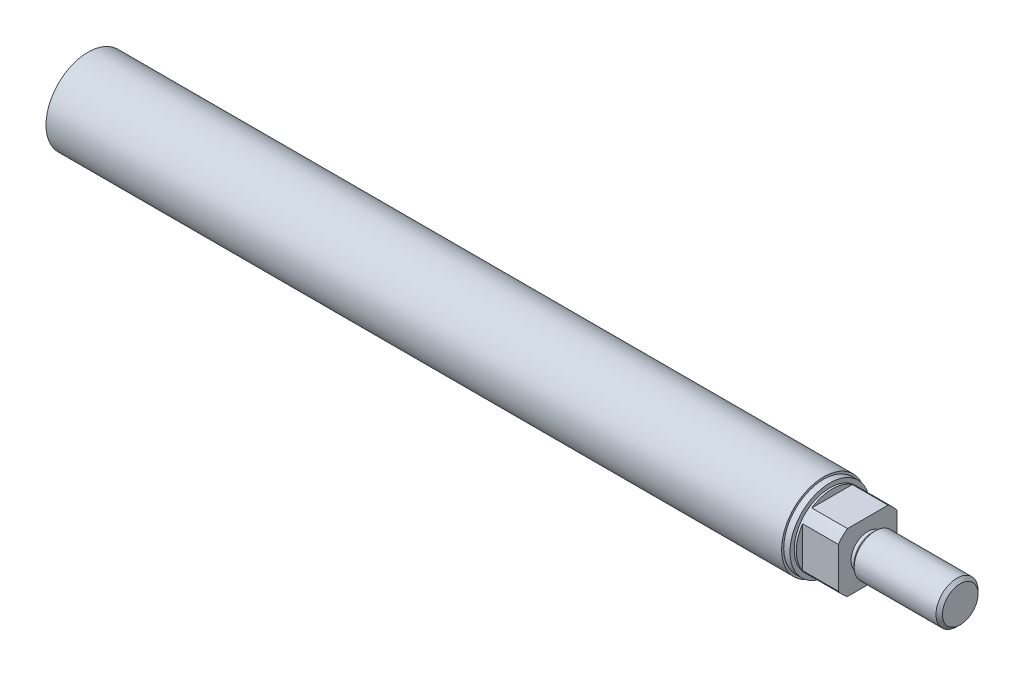
ISO-10303-21;
HEADER;
FILE_DESCRIPTION(('STEP AP214'),'2;1');
FILE_NAME('part.step','',(''),(''),'','','');
FILE_SCHEMA(('AUTOMOTIVE_DESIGN { 1 0 10303 214 1 1 1 1 }'));
ENDSEC;
DATA;
#1=APPLICATION_CONTEXT('core data for automotive mechanical design processes');
#2=APPLICATION_PROTOCOL_DEFINITION('international standard','automotive_design',2000,#1);
#3=PRODUCT_CONTEXT('',#1,'mechanical');
#4=PRODUCT('Part','Part','',(#3));
#5=PRODUCT_RELATED_PRODUCT_CATEGORY('part','',(#4));
#6=PRODUCT_DEFINITION_FORMATION('','',#4);
#7=PRODUCT_DEFINITION_CONTEXT('part definition',#1,'design');
#8=PRODUCT_DEFINITION('design','',#6,#7);
#9=PRODUCT_DEFINITION_SHAPE('','',#8);
#10=(LENGTH_UNIT() NAMED_UNIT(*) SI_UNIT(.MILLI.,.METRE.));
#11=(NAMED_UNIT(*) PLANE_ANGLE_UNIT() SI_UNIT($,.RADIAN.));
#12=(NAMED_UNIT(*) SI_UNIT($,.STERADIAN.) SOLID_ANGLE_UNIT());
#13=UNCERTAINTY_MEASURE_WITH_UNIT(LENGTH_MEASURE(1.E-05),#10,'distance_accuracy_value','');
#14=(GEOMETRIC_REPRESENTATION_CONTEXT(3) GLOBAL_UNCERTAINTY_ASSIGNED_CONTEXT((#13)) GLOBAL_UNIT_ASSIGNED_CONTEXT((#10,
#11,#12)) REPRESENTATION_CONTEXT('',''));
#15=CARTESIAN_POINT('',(0.,0.,0.));
#16=DIRECTION('',(0.,0.,1.));
#17=DIRECTION('',(1.,0.,0.));
#18=AXIS2_PLACEMENT_3D('',#15,#16,#17);
#19=CARTESIAN_POINT('',(42.5,0.,0.));
#20=DIRECTION('',(-1.,0.,0.));
#21=DIRECTION('',(0.,0.,1.));
#22=AXIS2_PLACEMENT_3D('',#19,#20,#21);
#23=CYLINDRICAL_SURFACE('',#22,8.5);
#24=CARTESIAN_POINT('',(11.5,0.,0.));
#25=DIRECTION('',(-1.,0.,0.));
#26=DIRECTION('',(0.,0.,1.));
#27=AXIS2_PLACEMENT_3D('',#24,#25,#26);
#28=CIRCLE('',#27,8.5);
#29=CARTESIAN_POINT('',(11.5,0.,8.5));
#30=VERTEX_POINT('',#29);
#31=EDGE_CURVE('E122',#30,#30,#28,.T.);
#32=ORIENTED_EDGE('',*,*,#31,.F.);
#33=EDGE_LOOP('',(#32));
#34=FACE_BOUND('',#33,.T.);
#35=DIRECTION('',(-1.,0.,0.));
#36=VECTOR('',#35,1.);
#37=CARTESIAN_POINT('',(42.5,7.,-4.82182538049648));
#38=LINE('',#37,#36);
#39=CARTESIAN_POINT('',(20.5,7.,-4.82182538049648));
#40=VERTEX_POINT('',#39);
#41=CARTESIAN_POINT('',(12.,7.,-4.82182538049648));
#42=VERTEX_POINT('',#41);
#43=EDGE_CURVE('E154',#40,#42,#38,.T.);
#44=ORIENTED_EDGE('',*,*,#43,.F.);
#45=CARTESIAN_POINT('',(20.5,0.,0.));
#46=DIRECTION('',(-1.,0.,0.));
#47=DIRECTION('',(0.,0.,1.));
#48=AXIS2_PLACEMENT_3D('',#45,#46,#47);
#49=CIRCLE('',#48,8.5);
#50=CARTESIAN_POINT('',(20.5,4.82182538049648,-7.));
#51=VERTEX_POINT('',#50);
#52=EDGE_CURVE('E123',#40,#51,#49,.T.);
#53=ORIENTED_EDGE('',*,*,#52,.T.);
#54=DIRECTION('',(-1.,0.,0.));
#55=VECTOR('',#54,1.);
#56=CARTESIAN_POINT('',(42.5,4.82182538049648,-7.));
#57=LINE('',#56,#55);
#58=CARTESIAN_POINT('',(12.,4.82182538049648,-7.));
#59=VERTEX_POINT('',#58);
#60=EDGE_CURVE('E160',#59,#51,#57,.F.);
#61=ORIENTED_EDGE('',*,*,#60,.F.);
#62=CARTESIAN_POINT('',(12.,0.,0.));
#63=DIRECTION('',(1.,0.,0.));
#64=DIRECTION('',(0.,0.,-1.));
#65=AXIS2_PLACEMENT_3D('',#62,#63,#64);
#66=CIRCLE('',#65,8.5);
#67=CARTESIAN_POINT('',(12.,-4.82182538049648,-7.));
#68=VERTEX_POINT('',#67);
#69=EDGE_CURVE('E44',#68,#59,#66,.T.);
#70=ORIENTED_EDGE('',*,*,#69,.F.);
#71=DIRECTION('',(-1.,0.,0.));
#72=VECTOR('',#71,1.);
#73=CARTESIAN_POINT('',(42.5,-4.82182538049648,-7.));
#74=LINE('',#73,#72);
#75=CARTESIAN_POINT('',(20.5,-4.82182538049648,-7.));
#76=VERTEX_POINT('',#75);
#77=EDGE_CURVE('E158',#76,#68,#74,.T.);
#78=ORIENTED_EDGE('',*,*,#77,.F.);
#79=CARTESIAN_POINT('',(20.5,-7.,-4.82182538049648));
#80=VERTEX_POINT('',#79);
#81=EDGE_CURVE('E130',#76,#80,#49,.T.);
#82=ORIENTED_EDGE('',*,*,#81,.T.);
#83=DIRECTION('',(-1.,0.,0.));
#84=VECTOR('',#83,1.);
#85=CARTESIAN_POINT('',(42.5,-7.,-4.82182538049648));
#86=LINE('',#85,#84);
#87=CARTESIAN_POINT('',(12.,-7.,-4.82182538049648));
#88=VERTEX_POINT('',#87);
#89=EDGE_CURVE('E59',#88,#80,#86,.F.);
#90=ORIENTED_EDGE('',*,*,#89,.F.);
#91=CARTESIAN_POINT('',(12.,-7.,4.82182538049648));
#92=VERTEX_POINT('',#91);
#93=EDGE_CURVE('E241',#92,#88,#66,.T.);
#94=ORIENTED_EDGE('',*,*,#93,.F.);
#95=DIRECTION('',(-1.,0.,0.));
#96=VECTOR('',#95,1.);
#97=CARTESIAN_POINT('',(42.5,-7.,4.82182538049648));
#98=LINE('',#97,#96);
#99=CARTESIAN_POINT('',(20.5,-7.,4.82182538049648));
#100=VERTEX_POINT('',#99);
#101=EDGE_CURVE('E162',#100,#92,#98,.T.);
#102=ORIENTED_EDGE('',*,*,#101,.F.);
#103=CARTESIAN_POINT('',(20.5,-4.82182538049648,7.));
#104=VERTEX_POINT('',#103);
#105=EDGE_CURVE('E125',#100,#104,#49,.T.);
#106=ORIENTED_EDGE('',*,*,#105,.T.);
#107=DIRECTION('',(-1.,0.,0.));
#108=VECTOR('',#107,1.);
#109=CARTESIAN_POINT('',(42.5,-4.82182538049648,7.));
#110=LINE('',#109,#108);
#111=CARTESIAN_POINT('',(12.,-4.82182538049648,7.));
#112=VERTEX_POINT('',#111);
#113=EDGE_CURVE('E51',#112,#104,#110,.F.);
#114=ORIENTED_EDGE('',*,*,#113,.F.);
#115=CARTESIAN_POINT('',(12.,4.82182538049648,7.));
#116=VERTEX_POINT('',#115);
#117=EDGE_CURVE('E39',#116,#112,#66,.T.);
#118=ORIENTED_EDGE('',*,*,#117,.F.);
#119=DIRECTION('',(-1.,0.,0.));
#120=VECTOR('',#119,1.);
#121=CARTESIAN_POINT('',(42.5,4.82182538049648,7.));
#122=LINE('',#121,#120);
#123=CARTESIAN_POINT('',(20.5,4.82182538049648,7.));
#124=VERTEX_POINT('',#123);
#125=EDGE_CURVE('E102',#124,#116,#122,.T.);
#126=ORIENTED_EDGE('',*,*,#125,.F.);
#127=CARTESIAN_POINT('',(20.5,7.,4.82182538049648));
#128=VERTEX_POINT('',#127);
#129=EDGE_CURVE('E116',#124,#128,#49,.T.);
#130=ORIENTED_EDGE('',*,*,#129,.T.);
#131=DIRECTION('',(-1.,0.,0.));
#132=VECTOR('',#131,1.);
#133=CARTESIAN_POINT('',(42.5,7.,4.82182538049648));
#134=LINE('',#133,#132);
#135=CARTESIAN_POINT('',(12.,7.,4.82182538049648));
#136=VERTEX_POINT('',#135);
#137=EDGE_CURVE('E156',#136,#128,#134,.F.);
#138=ORIENTED_EDGE('',*,*,#137,.F.);
#139=EDGE_CURVE('E11',#42,#136,#66,.T.);
#140=ORIENTED_EDGE('',*,*,#139,.F.);
#141=EDGE_LOOP('',(#44,#53,#61,#70,#78,#82,#90,#94,#102,#106,#114,#118,#126,#130,#138,#140));
#142=FACE_BOUND('',#141,.T.);
#143=ADVANCED_FACE('F35',(#34,#142),#23,.T.);
#144=CARTESIAN_POINT('',(20.5,8.5,0.));
#145=DIRECTION('',(-1.,0.,0.));
#146=DIRECTION('',(0.,0.,1.));
#147=AXIS2_PLACEMENT_3D('',#144,#145,#146);
#148=PLANE('',#147);
#149=CARTESIAN_POINT('',(20.5,0.,0.));
#150=DIRECTION('',(-1.,0.,0.));
#151=DIRECTION('',(0.,0.,1.));
#152=AXIS2_PLACEMENT_3D('',#149,#150,#151);
#153=CIRCLE('',#152,4.);
#154=CARTESIAN_POINT('',(20.5,0.,4.));
#155=VERTEX_POINT('',#154);
#156=EDGE_CURVE('E132',#155,#155,#153,.T.);
#157=ORIENTED_EDGE('',*,*,#156,.T.);
#158=EDGE_LOOP('',(#157));
#159=FACE_BOUND('',#158,.T.);
#160=DIRECTION('',(0.,0.,-1.));
#161=VECTOR('',#160,1.);
#162=CARTESIAN_POINT('',(20.5,7.,0.));
#163=LINE('',#162,#161);
#164=EDGE_CURVE('E121',#128,#40,#163,.T.);
#165=ORIENTED_EDGE('',*,*,#164,.F.);
#166=ORIENTED_EDGE('',*,*,#129,.F.);
#167=DIRECTION('',(0.,1.,0.));
#168=VECTOR('',#167,1.);
#169=CARTESIAN_POINT('',(20.5,8.5,7.));
#170=LINE('',#169,#168);
#171=EDGE_CURVE('E99',#104,#124,#170,.T.);
#172=ORIENTED_EDGE('',*,*,#171,.F.);
#173=ORIENTED_EDGE('',*,*,#105,.F.);
#174=DIRECTION('',(0.,0.,1.));
#175=VECTOR('',#174,1.);
#176=CARTESIAN_POINT('',(20.5,-7.,0.));
#177=LINE('',#176,#175);
#178=EDGE_CURVE('E108',#80,#100,#177,.T.);
#179=ORIENTED_EDGE('',*,*,#178,.F.);
#180=ORIENTED_EDGE('',*,*,#81,.F.);
#181=DIRECTION('',(0.,-1.,0.));
#182=VECTOR('',#181,1.);
#183=CARTESIAN_POINT('',(20.5,8.5,-7.));
#184=LINE('',#183,#182);
#185=EDGE_CURVE('E240',#51,#76,#184,.T.);
#186=ORIENTED_EDGE('',*,*,#185,.F.);
#187=ORIENTED_EDGE('',*,*,#52,.F.);
#188=EDGE_LOOP('',(#165,#166,#172,#173,#179,#180,#186,#187));
#189=FACE_BOUND('',#188,.T.);
#190=ADVANCED_FACE('F119',(#159,#189),#148,.F.);
#191=CARTESIAN_POINT('',(-165.,0.,0.));
#192=DIRECTION('',(1.,0.,0.));
#193=DIRECTION('',(0.,0.,-1.));
#194=AXIS2_PLACEMENT_3D('',#191,#192,#193);
#195=PLANE('',#194);
#196=CARTESIAN_POINT('',(-165.,0.,0.));
#197=DIRECTION('',(-1.,0.,0.));
#198=DIRECTION('',(0.,0.,1.));
#199=AXIS2_PLACEMENT_3D('',#196,#197,#198);
#200=CIRCLE('',#199,10.);
#201=CARTESIAN_POINT('',(-165.,0.,10.));
#202=VERTEX_POINT('',#201);
#203=EDGE_CURVE('E109',#202,#202,#200,.T.);
#204=ORIENTED_EDGE('',*,*,#203,.T.);
#205=EDGE_LOOP('',(#204));
#206=FACE_BOUND('',#205,.T.);
#207=ADVANCED_FACE('F37',(#206),#195,.F.);
#208=CARTESIAN_POINT('',(42.5,0.,0.));
#209=DIRECTION('',(-1.,0.,0.));
#210=DIRECTION('',(0.,0.,1.));
#211=AXIS2_PLACEMENT_3D('',#208,#209,#210);
#212=CYLINDRICAL_SURFACE('',#211,10.);
#213=ORIENTED_EDGE('',*,*,#203,.F.);
#214=EDGE_LOOP('',(#213));
#215=FACE_BOUND('',#214,.T.);
#216=CARTESIAN_POINT('',(10.,0.,0.));
#217=DIRECTION('',(-1.,0.,0.));
#218=DIRECTION('',(0.,0.,1.));
#219=AXIS2_PLACEMENT_3D('',#216,#217,#218);
#220=CIRCLE('',#219,10.);
#221=CARTESIAN_POINT('',(10.,0.,10.));
#222=VERTEX_POINT('',#221);
#223=EDGE_CURVE('E231',#222,#222,#220,.T.);
#224=ORIENTED_EDGE('',*,*,#223,.T.);
#225=EDGE_LOOP('',(#224));
#226=FACE_BOUND('',#225,.T.);
#227=ADVANCED_FACE('F218',(#215,#226),#212,.T.);
#228=CARTESIAN_POINT('',(10.,10.,0.));
#229=DIRECTION('',(-1.,0.,0.));
#230=DIRECTION('',(0.,0.,1.));
#231=AXIS2_PLACEMENT_3D('',#228,#229,#230);
#232=PLANE('',#231);
#233=ORIENTED_EDGE('',*,*,#223,.F.);
#234=EDGE_LOOP('',(#233));
#235=FACE_BOUND('',#234,.T.);
#236=CARTESIAN_POINT('',(10.,0.,0.));
#237=DIRECTION('',(-1.,0.,0.));
#238=DIRECTION('',(0.,0.,1.));
#239=AXIS2_PLACEMENT_3D('',#236,#237,#238);
#240=CIRCLE('',#239,9.5);
#241=CARTESIAN_POINT('',(10.,0.,9.5));
#242=VERTEX_POINT('',#241);
#243=EDGE_CURVE('E232',#242,#242,#240,.T.);
#244=ORIENTED_EDGE('',*,*,#243,.T.);
#245=EDGE_LOOP('',(#244));
#246=FACE_BOUND('',#245,.T.);
#247=ADVANCED_FACE('F215',(#235,#246),#232,.F.);
#248=CARTESIAN_POINT('',(42.5,0.,0.));
#249=DIRECTION('',(-1.,0.,0.));
#250=DIRECTION('',(0.,0.,1.));
#251=AXIS2_PLACEMENT_3D('',#248,#249,#250);
#252=CYLINDRICAL_SURFACE('',#251,9.5);
#253=ORIENTED_EDGE('',*,*,#243,.F.);
#254=EDGE_LOOP('',(#253));
#255=FACE_BOUND('',#254,.T.);
#256=CARTESIAN_POINT('',(11.5,0.,0.));
#257=DIRECTION('',(-1.,0.,0.));
#258=DIRECTION('',(0.,0.,1.));
#259=AXIS2_PLACEMENT_3D('',#256,#257,#258);
#260=CIRCLE('',#259,9.5);
#261=CARTESIAN_POINT('',(11.5,0.,9.5));
#262=VERTEX_POINT('',#261);
#263=EDGE_CURVE('E127',#262,#262,#260,.T.);
#264=ORIENTED_EDGE('',*,*,#263,.T.);
#265=EDGE_LOOP('',(#264));
#266=FACE_BOUND('',#265,.T.);
#267=ADVANCED_FACE('F211',(#255,#266),#252,.T.);
#268=CARTESIAN_POINT('',(11.5,9.5,0.));
#269=DIRECTION('',(-1.,0.,0.));
#270=DIRECTION('',(0.,0.,1.));
#271=AXIS2_PLACEMENT_3D('',#268,#269,#270);
#272=PLANE('',#271);
#273=ORIENTED_EDGE('',*,*,#263,.F.);
#274=EDGE_LOOP('',(#273));
#275=FACE_BOUND('',#274,.T.);
#276=ORIENTED_EDGE('',*,*,#31,.T.);
#277=EDGE_LOOP('',(#276));
#278=FACE_BOUND('',#277,.T.);
#279=ADVANCED_FACE('F207',(#275,#278),#272,.F.);
#280=CARTESIAN_POINT('',(42.5,0.,0.));
#281=DIRECTION('',(-1.,0.,0.));
#282=DIRECTION('',(0.,0.,1.));
#283=AXIS2_PLACEMENT_3D('',#280,#281,#282);
#284=CYLINDRICAL_SURFACE('',#283,4.);
#285=ORIENTED_EDGE('',*,*,#156,.F.);
#286=EDGE_LOOP('',(#285));
#287=FACE_BOUND('',#286,.T.);
#288=CARTESIAN_POINT('',(21.5,0.,0.));
#289=DIRECTION('',(-1.,0.,0.));
#290=DIRECTION('',(0.,0.,1.));
#291=AXIS2_PLACEMENT_3D('',#288,#289,#290);
#292=CIRCLE('',#291,4.);
#293=CARTESIAN_POINT('',(21.5,0.,4.));
#294=VERTEX_POINT('',#293);
#295=EDGE_CURVE('E136',#294,#294,#292,.T.);
#296=ORIENTED_EDGE('',*,*,#295,.T.);
#297=EDGE_LOOP('',(#296));
#298=FACE_BOUND('',#297,.T.);
#299=ADVANCED_FACE('F210',(#287,#298),#284,.T.);
#300=CARTESIAN_POINT('',(21.5,4.,0.));
#301=DIRECTION('',(1.,0.,0.));
#302=DIRECTION('',(0.,0.,-1.));
#303=AXIS2_PLACEMENT_3D('',#300,#301,#302);
#304=PLANE('',#303);
#305=ORIENTED_EDGE('',*,*,#295,.F.);
#306=EDGE_LOOP('',(#305));
#307=FACE_BOUND('',#306,.T.);
#308=CARTESIAN_POINT('',(21.5,0.,0.));
#309=DIRECTION('',(-1.,0.,0.));
#310=DIRECTION('',(0.,0.,1.));
#311=AXIS2_PLACEMENT_3D('',#308,#309,#310);
#312=CIRCLE('',#311,4.2330000000001);
#313=CARTESIAN_POINT('',(21.5,0.,4.2330000000001));
#314=VERTEX_POINT('',#313);
#315=EDGE_CURVE('E140',#314,#314,#312,.T.);
#316=ORIENTED_EDGE('',*,*,#315,.T.);
#317=EDGE_LOOP('',(#316));
#318=FACE_BOUND('',#317,.T.);
#319=ADVANCED_FACE('F280',(#307,#318),#304,.F.);
#320=CARTESIAN_POINT('',(22.267,0.,0.));
#321=DIRECTION('',(1.,0.,0.));
#322=DIRECTION('',(0.,0.,-1.));
#323=AXIS2_PLACEMENT_3D('',#320,#321,#322);
#324=CONICAL_SURFACE('',#323,5.,0.785398163397383);
#325=ORIENTED_EDGE('',*,*,#315,.F.);
#326=EDGE_LOOP('',(#325));
#327=FACE_BOUND('',#326,.T.);
#328=CARTESIAN_POINT('',(22.267,0.,0.));
#329=DIRECTION('',(-1.,0.,0.));
#330=DIRECTION('',(0.,0.,1.));
#331=AXIS2_PLACEMENT_3D('',#328,#329,#330);
#332=CIRCLE('',#331,5.);
#333=CARTESIAN_POINT('',(22.267,0.,5.));
#334=VERTEX_POINT('',#333);
#335=EDGE_CURVE('E145',#334,#334,#332,.T.);
#336=ORIENTED_EDGE('',*,*,#335,.T.);
#337=EDGE_LOOP('',(#336));
#338=FACE_BOUND('',#337,.T.);
#339=ADVANCED_FACE('F276',(#327,#338),#324,.T.);
#340=CARTESIAN_POINT('',(42.5,0.,0.));
#341=DIRECTION('',(-1.,0.,0.));
#342=DIRECTION('',(0.,0.,1.));
#343=AXIS2_PLACEMENT_3D('',#340,#341,#342);
#344=CYLINDRICAL_SURFACE('',#343,5.);
#345=ORIENTED_EDGE('',*,*,#335,.F.);
#346=EDGE_LOOP('',(#345));
#347=FACE_BOUND('',#346,.T.);
#348=CARTESIAN_POINT('',(41.733,0.,0.));
#349=DIRECTION('',(-1.,0.,0.));
#350=DIRECTION('',(0.,0.,1.));
#351=AXIS2_PLACEMENT_3D('',#348,#349,#350);
#352=CIRCLE('',#351,5.);
#353=CARTESIAN_POINT('',(41.733,0.,5.));
#354=VERTEX_POINT('',#353);
#355=EDGE_CURVE('E148',#354,#354,#352,.T.);
#356=ORIENTED_EDGE('',*,*,#355,.T.);
#357=EDGE_LOOP('',(#356));
#358=FACE_BOUND('',#357,.T.);
#359=ADVANCED_FACE('F269',(#347,#358),#344,.T.);
#360=CARTESIAN_POINT('',(42.5,0.,0.));
#361=DIRECTION('',(-1.,0.,0.));
#362=DIRECTION('',(0.,0.,1.));
#363=AXIS2_PLACEMENT_3D('',#360,#361,#362);
#364=CONICAL_SURFACE('',#363,4.2330000000001,0.78539816339738);
#365=ORIENTED_EDGE('',*,*,#355,.F.);
#366=EDGE_LOOP('',(#365));
#367=FACE_BOUND('',#366,.T.);
#368=CARTESIAN_POINT('',(42.5,0.,0.));
#369=DIRECTION('',(-1.,0.,0.));
#370=DIRECTION('',(0.,0.,1.));
#371=AXIS2_PLACEMENT_3D('',#368,#369,#370);
#372=CIRCLE('',#371,4.2330000000001);
#373=CARTESIAN_POINT('',(42.5,0.,4.2330000000001));
#374=VERTEX_POINT('',#373);
#375=EDGE_CURVE('E151',#374,#374,#372,.T.);
#376=ORIENTED_EDGE('',*,*,#375,.T.);
#377=EDGE_LOOP('',(#376));
#378=FACE_BOUND('',#377,.T.);
#379=ADVANCED_FACE('F264',(#367,#378),#364,.T.);
#380=CARTESIAN_POINT('',(42.5,4.2330000000001,0.));
#381=DIRECTION('',(-1.,0.,0.));
#382=DIRECTION('',(0.,0.,1.));
#383=AXIS2_PLACEMENT_3D('',#380,#381,#382);
#384=PLANE('',#383);
#385=ORIENTED_EDGE('',*,*,#375,.F.);
#386=EDGE_LOOP('',(#385));
#387=FACE_BOUND('',#386,.T.);
#388=ADVANCED_FACE('F260',(#387),#384,.F.);
#389=CARTESIAN_POINT('',(12.,7.,7.));
#390=DIRECTION('',(0.,0.,1.));
#391=DIRECTION('',(1.,0.,0.));
#392=AXIS2_PLACEMENT_3D('',#389,#390,#391);
#393=PLANE('',#392);
#394=ORIENTED_EDGE('',*,*,#125,.T.);
#395=DIRECTION('',(0.,-1.,0.));
#396=VECTOR('',#395,1.);
#397=CARTESIAN_POINT('',(12.,7.,7.));
#398=LINE('',#397,#396);
#399=EDGE_CURVE('E171',#116,#112,#398,.T.);
#400=ORIENTED_EDGE('',*,*,#399,.T.);
#401=ORIENTED_EDGE('',*,*,#113,.T.);
#402=ORIENTED_EDGE('',*,*,#171,.T.);
#403=EDGE_LOOP('',(#394,#400,#401,#402));
#404=FACE_BOUND('',#403,.T.);
#405=ADVANCED_FACE('F101',(#404),#393,.T.);
#406=CARTESIAN_POINT('',(12.,0.,0.));
#407=DIRECTION('',(1.,0.,0.));
#408=DIRECTION('',(0.,0.,-1.));
#409=AXIS2_PLACEMENT_3D('',#406,#407,#408);
#410=PLANE('',#409);
#411=ORIENTED_EDGE('',*,*,#117,.T.);
#412=ORIENTED_EDGE('',*,*,#399,.F.);
#413=EDGE_LOOP('',(#411,#412));
#414=FACE_BOUND('',#413,.T.);
#415=ADVANCED_FACE('F184',(#414),#410,.T.);
#416=CARTESIAN_POINT('',(12.,-7.,7.));
#417=DIRECTION('',(0.,-1.,0.));
#418=DIRECTION('',(0.,0.,-1.));
#419=AXIS2_PLACEMENT_3D('',#416,#417,#418);
#420=PLANE('',#419);
#421=ORIENTED_EDGE('',*,*,#101,.T.);
#422=DIRECTION('',(0.,0.,-1.));
#423=VECTOR('',#422,1.);
#424=CARTESIAN_POINT('',(12.,-7.,7.));
#425=LINE('',#424,#423);
#426=EDGE_CURVE('E169',#92,#88,#425,.T.);
#427=ORIENTED_EDGE('',*,*,#426,.T.);
#428=ORIENTED_EDGE('',*,*,#89,.T.);
#429=ORIENTED_EDGE('',*,*,#178,.T.);
#430=EDGE_LOOP('',(#421,#427,#428,#429));
#431=FACE_BOUND('',#430,.T.);
#432=ADVANCED_FACE('F195',(#431),#420,.T.);
#433=ORIENTED_EDGE('',*,*,#93,.T.);
#434=ORIENTED_EDGE('',*,*,#426,.F.);
#435=EDGE_LOOP('',(#433,#434));
#436=FACE_BOUND('',#435,.T.);
#437=ADVANCED_FACE('F192',(#436),#410,.T.);
#438=CARTESIAN_POINT('',(12.,-7.,-7.));
#439=DIRECTION('',(0.,0.,-1.));
#440=DIRECTION('',(-1.,0.,0.));
#441=AXIS2_PLACEMENT_3D('',#438,#439,#440);
#442=PLANE('',#441);
#443=ORIENTED_EDGE('',*,*,#77,.T.);
#444=DIRECTION('',(0.,1.,0.));
#445=VECTOR('',#444,1.);
#446=CARTESIAN_POINT('',(12.,-7.,-7.));
#447=LINE('',#446,#445);
#448=EDGE_CURVE('E166',#68,#59,#447,.T.);
#449=ORIENTED_EDGE('',*,*,#448,.T.);
#450=ORIENTED_EDGE('',*,*,#60,.T.);
#451=ORIENTED_EDGE('',*,*,#185,.T.);
#452=EDGE_LOOP('',(#443,#449,#450,#451));
#453=FACE_BOUND('',#452,.T.);
#454=ADVANCED_FACE('F190',(#453),#442,.T.);
#455=ORIENTED_EDGE('',*,*,#69,.T.);
#456=ORIENTED_EDGE('',*,*,#448,.F.);
#457=EDGE_LOOP('',(#455,#456));
#458=FACE_BOUND('',#457,.T.);
#459=ADVANCED_FACE('F182',(#458),#410,.T.);
#460=ORIENTED_EDGE('',*,*,#139,.T.);
#461=DIRECTION('',(0.,0.,1.));
#462=VECTOR('',#461,1.);
#463=CARTESIAN_POINT('',(12.,7.,-7.));
#464=LINE('',#463,#462);
#465=EDGE_CURVE('E173',#42,#136,#464,.T.);
#466=ORIENTED_EDGE('',*,*,#465,.F.);
#467=EDGE_LOOP('',(#460,#466));
#468=FACE_BOUND('',#467,.T.);
#469=ADVANCED_FACE('F180',(#468),#410,.T.);
#470=CARTESIAN_POINT('',(12.,7.,-7.));
#471=DIRECTION('',(0.,1.,0.));
#472=DIRECTION('',(0.,0.,1.));
#473=AXIS2_PLACEMENT_3D('',#470,#471,#472);
#474=PLANE('',#473);
#475=ORIENTED_EDGE('',*,*,#43,.T.);
#476=ORIENTED_EDGE('',*,*,#465,.T.);
#477=ORIENTED_EDGE('',*,*,#137,.T.);
#478=ORIENTED_EDGE('',*,*,#164,.T.);
#479=EDGE_LOOP('',(#475,#476,#477,#478));
#480=FACE_BOUND('',#479,.T.);
#481=ADVANCED_FACE('F177',(#480),#474,.T.);
#482=CLOSED_SHELL('',(#143,#190,#207,#227,#247,#267,#279,#299,#319,#339,#359,#379,#388,#405,
#415,#432,#437,#454,#459,#469,#481));
#483=MANIFOLD_SOLID_BREP('B2',#482);
#484=ADVANCED_BREP_SHAPE_REPRESENTATION('',(#18,#483),#14);
#485=SHAPE_DEFINITION_REPRESENTATION(#9,#484);
ENDSEC;
END-ISO-10303-21;
